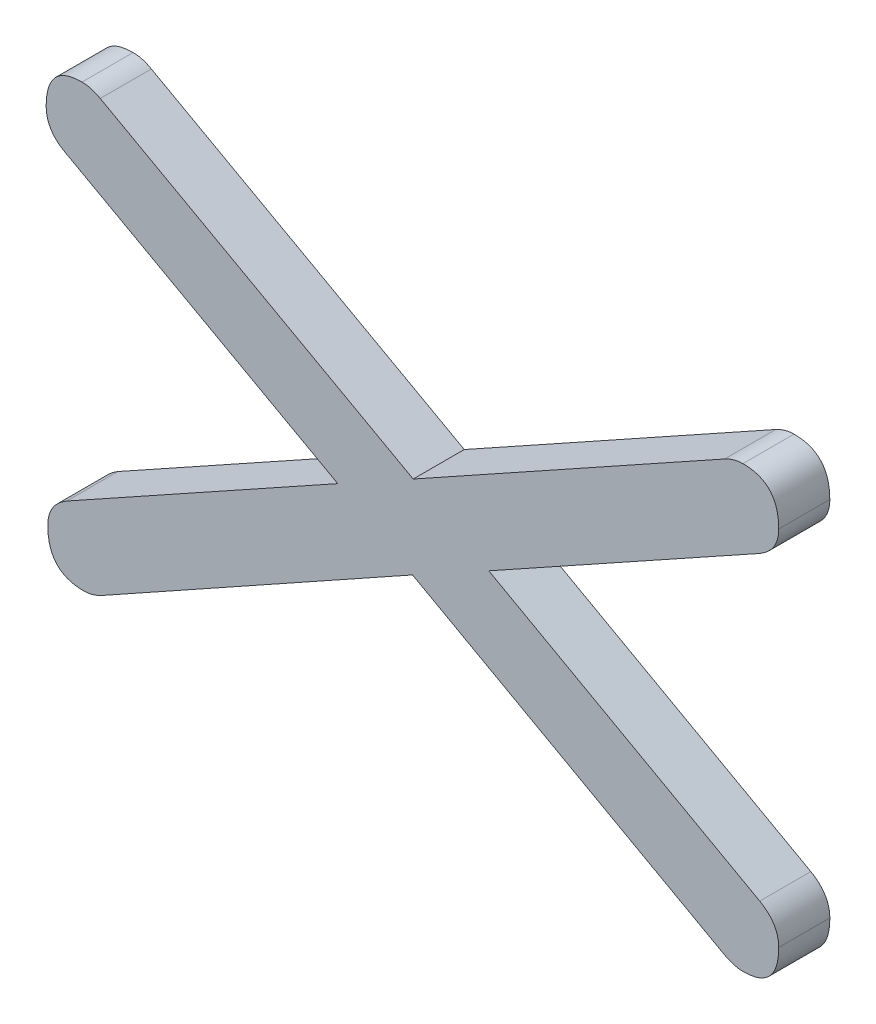
ISO-10303-21;
HEADER;
FILE_DESCRIPTION(('STEP AP214'),'2;1');
FILE_NAME('part.step','',(''),(''),'','','');
FILE_SCHEMA(('AUTOMOTIVE_DESIGN { 1 0 10303 214 1 1 1 1 }'));
ENDSEC;
DATA;
#1=APPLICATION_CONTEXT('core data for automotive mechanical design processes');
#2=APPLICATION_PROTOCOL_DEFINITION('international standard','automotive_design',2000,#1);
#3=PRODUCT_CONTEXT('',#1,'mechanical');
#4=PRODUCT('Part','Part','',(#3));
#5=PRODUCT_RELATED_PRODUCT_CATEGORY('part','',(#4));
#6=PRODUCT_DEFINITION_FORMATION('','',#4);
#7=PRODUCT_DEFINITION_CONTEXT('part definition',#1,'design');
#8=PRODUCT_DEFINITION('design','',#6,#7);
#9=PRODUCT_DEFINITION_SHAPE('','',#8);
#10=(LENGTH_UNIT() NAMED_UNIT(*) SI_UNIT(.MILLI.,.METRE.));
#11=(NAMED_UNIT(*) PLANE_ANGLE_UNIT() SI_UNIT($,.RADIAN.));
#12=(NAMED_UNIT(*) SI_UNIT($,.STERADIAN.) SOLID_ANGLE_UNIT());
#13=UNCERTAINTY_MEASURE_WITH_UNIT(LENGTH_MEASURE(1.E-05),#10,'distance_accuracy_value','');
#14=(GEOMETRIC_REPRESENTATION_CONTEXT(3) GLOBAL_UNCERTAINTY_ASSIGNED_CONTEXT((#13)) GLOBAL_UNIT_ASSIGNED_CONTEXT((#10,
#11,#12)) REPRESENTATION_CONTEXT('',''));
#15=CARTESIAN_POINT('',(0.,0.,0.));
#16=DIRECTION('',(0.,0.,1.));
#17=DIRECTION('',(1.,0.,0.));
#18=AXIS2_PLACEMENT_3D('',#15,#16,#17);
#19=CARTESIAN_POINT('',(0.8,12.2,-2.6));
#20=DIRECTION('',(0.,0.,1.));
#21=DIRECTION('',(1.,0.,0.));
#22=AXIS2_PLACEMENT_3D('',#19,#20,#21);
#23=PLANE('',#22);
#24=CARTESIAN_POINT('',(-1.8004,11.3994,-2.6));
#25=CARTESIAN_POINT('',(-1.8004,11.32365,-2.6));
#26=CARTESIAN_POINT('',(-1.7303,11.32365,-2.6));
#27=B_SPLINE_CURVE_WITH_KNOTS('',2,(#24,#25,#26),.UNSPECIFIED.,.F.,.F.,(3,3),(0.,1.),.UNSPECIFIED.);
#28=CARTESIAN_POINT('',(-1.8004,11.3994,-2.6));
#29=VERTEX_POINT('',#28);
#30=CARTESIAN_POINT('',(-1.7303,11.32365,-2.6));
#31=VERTEX_POINT('',#30);
#32=EDGE_CURVE('E202',#29,#31,#27,.T.);
#33=ORIENTED_EDGE('',*,*,#32,.T.);
#34=CARTESIAN_POINT('',(-1.7303,11.32365,-2.6));
#35=CARTESIAN_POINT('',(-1.72674873610482,11.323645480911,-2.6));
#36=CARTESIAN_POINT('',(-1.72322154157408,11.3239708863246,-2.6));
#37=CARTESIAN_POINT('',(-1.71626401609487,11.325176056098,-2.6));
#38=CARTESIAN_POINT('',(-1.71283359588712,11.3260552909242,-2.6));
#39=CARTESIAN_POINT('',(-1.70430723901425,11.3288555474114,-2.6));
#40=CARTESIAN_POINT('',(-1.69930568983797,11.3310824424114,-2.6));
#41=CARTESIAN_POINT('',(-1.69455,11.33365,-2.6));
#42=B_SPLINE_CURVE_WITH_KNOTS('',3,(#34,#35,#36,#37,#38,#39,#40,#41),.UNSPECIFIED.,.F.,.F.,(4,2,
2,4),(0.,0.0105992136815406,0.0211883084724336,0.0374613490171502),.UNSPECIFIED.);
#43=CARTESIAN_POINT('',(-1.69455,11.33365,-2.6));
#44=VERTEX_POINT('',#43);
#45=EDGE_CURVE('E178',#31,#44,#42,.T.);
#46=ORIENTED_EDGE('',*,*,#45,.T.);
#47=DIRECTION('',(0.873529571012869,0.486771084356982,0.));
#48=VECTOR('',#47,1.);
#49=CARTESIAN_POINT('',(-1.69455,11.33365,-2.6));
#50=LINE('',#49,#48);
#51=CARTESIAN_POINT('',(-1.08665,11.6724,-2.6));
#52=VERTEX_POINT('',#51);
#53=EDGE_CURVE('E176',#52,#44,#50,.F.);
#54=ORIENTED_EDGE('',*,*,#53,.F.);
#55=DIRECTION('',(0.874511603354022,-0.485004593379462,0.));
#56=VECTOR('',#55,1.);
#57=CARTESIAN_POINT('',(-1.08665,11.6724,-2.6));
#58=LINE('',#57,#56);
#59=CARTESIAN_POINT('',(-0.47585,11.33365,-2.6));
#60=VERTEX_POINT('',#59);
#61=EDGE_CURVE('E146',#60,#52,#58,.F.);
#62=ORIENTED_EDGE('',*,*,#61,.F.);
#63=CARTESIAN_POINT('',(-0.47585,11.33365,-2.6));
#64=CARTESIAN_POINT('',(-0.472752801885299,11.3319836587269,-2.6));
#65=CARTESIAN_POINT('',(-0.469561027604608,11.3304601961346,-2.6));
#66=CARTESIAN_POINT('',(-0.463018364400051,11.3278029139356,-2.6));
#67=CARTESIAN_POINT('',(-0.45966736496484,11.3266693695866,-2.6));
#68=CARTESIAN_POINT('',(-0.450997424090528,11.3244202712736,-2.6));
#69=CARTESIAN_POINT('',(-0.445593009487037,11.3236450218596,-2.6));
#70=CARTESIAN_POINT('',(-0.440100000014694,11.32365,-2.6));
#71=B_SPLINE_CURVE_WITH_KNOTS('',3,(#63,#64,#65,#66,#67,#68,#69,#70),.UNSPECIFIED.,.F.,.F.,(4,2,
2,4),(0.,0.0105730556527225,0.0211535599700237,0.0374479472269656),.UNSPECIFIED.);
#72=CARTESIAN_POINT('',(-0.4401,11.32365,-2.6));
#73=VERTEX_POINT('',#72);
#74=EDGE_CURVE('E24',#60,#73,#71,.T.);
#75=ORIENTED_EDGE('',*,*,#74,.T.);
#76=CARTESIAN_POINT('',(-0.4401,11.32365,-2.6));
#77=CARTESIAN_POINT('',(-0.37,11.32365,-2.6));
#78=CARTESIAN_POINT('',(-0.37,11.3994,-2.6));
#79=B_SPLINE_CURVE_WITH_KNOTS('',2,(#76,#77,#78),.UNSPECIFIED.,.F.,.F.,(3,3),(0.,1.),.UNSPECIFIED.);
#80=CARTESIAN_POINT('',(-0.37,11.3994,-2.6));
#81=VERTEX_POINT('',#80);
#82=EDGE_CURVE('E150',#73,#81,#79,.T.);
#83=ORIENTED_EDGE('',*,*,#82,.T.);
#84=CARTESIAN_POINT('',(-0.37,11.3994,-2.6));
#85=CARTESIAN_POINT('',(-0.37,11.438,-2.6));
#86=CARTESIAN_POINT('',(-0.40715,11.4594,-2.6));
#87=B_SPLINE_CURVE_WITH_KNOTS('',2,(#84,#85,#86),.UNSPECIFIED.,.F.,.F.,(3,3),(0.,1.),.UNSPECIFIED.);
#88=CARTESIAN_POINT('',(-0.40715,11.4594,-2.6));
#89=VERTEX_POINT('',#88);
#90=EDGE_CURVE('E182',#81,#89,#87,.T.);
#91=ORIENTED_EDGE('',*,*,#90,.T.);
#92=DIRECTION('',(-0.874165051646027,0.48562893497062,0.));
#93=VECTOR('',#92,1.);
#94=CARTESIAN_POINT('',(-0.40715,11.4594,-2.6));
#95=LINE('',#94,#93);
#96=CARTESIAN_POINT('',(-0.93745,11.754,-2.6));
#97=VERTEX_POINT('',#96);
#98=EDGE_CURVE('E336',#97,#89,#95,.F.);
#99=ORIENTED_EDGE('',*,*,#98,.F.);
#100=DIRECTION('',(0.87420004044454,0.485565947412671,0.));
#101=VECTOR('',#100,1.);
#102=CARTESIAN_POINT('',(-0.93745,11.754,-2.6));
#103=LINE('',#102,#101);
#104=CARTESIAN_POINT('',(-0.407150000000001,12.04855,-2.6));
#105=VERTEX_POINT('',#104);
#106=EDGE_CURVE('E341',#105,#97,#103,.F.);
#107=ORIENTED_EDGE('',*,*,#106,.F.);
#108=CARTESIAN_POINT('',(-0.40715,12.04855,-2.6));
#109=CARTESIAN_POINT('',(-0.37,12.07,-2.6));
#110=CARTESIAN_POINT('',(-0.37,12.1086,-2.6));
#111=B_SPLINE_CURVE_WITH_KNOTS('',2,(#108,#109,#110),.UNSPECIFIED.,.F.,.F.,(3,3),(0.,1.),.UNSPECIFIED.);
#112=CARTESIAN_POINT('',(-0.37,12.1086,-2.6));
#113=VERTEX_POINT('',#112);
#114=EDGE_CURVE('E210',#105,#113,#111,.T.);
#115=ORIENTED_EDGE('',*,*,#114,.T.);
#116=CARTESIAN_POINT('',(-0.37,12.1086,-2.6));
#117=CARTESIAN_POINT('',(-0.37,12.18435,-2.6));
#118=CARTESIAN_POINT('',(-0.4401,12.18435,-2.6));
#119=B_SPLINE_CURVE_WITH_KNOTS('',2,(#116,#117,#118),.UNSPECIFIED.,.F.,.F.,(3,3),(0.,1.),.UNSPECIFIED.);
#120=CARTESIAN_POINT('',(-0.4401,12.18435,-2.6));
#121=VERTEX_POINT('',#120);
#122=EDGE_CURVE('E214',#113,#121,#119,.T.);
#123=ORIENTED_EDGE('',*,*,#122,.T.);
#124=CARTESIAN_POINT('',(-0.4401,12.18435,-2.6));
#125=CARTESIAN_POINT('',(-0.443643347746503,12.1843549953723,-2.6));
#126=CARTESIAN_POINT('',(-0.447163301614119,12.1840325046237,-2.6));
#127=CARTESIAN_POINT('',(-0.454107279371382,12.1828353933846,-2.6));
#128=CARTESIAN_POINT('',(-0.45753138758187,12.1819612752255,-2.6));
#129=CARTESIAN_POINT('',(-0.466067450876708,12.1791651523464,-2.6));
#130=CARTESIAN_POINT('',(-0.471083515409301,12.176931744279,-2.6));
#131=CARTESIAN_POINT('',(-0.47585,12.17435,-2.6));
#132=B_SPLINE_CURVE_WITH_KNOTS('',3,(#124,#125,#126,#127,#128,#129,#130,#131),.UNSPECIFIED.,.F.,
.F.,(4,2,2,4),(0.,0.0105766380914163,0.0211436585971436,0.0374630894370165),.UNSPECIFIED.);
#133=CARTESIAN_POINT('',(-0.47585,12.17435,-2.6));
#134=VERTEX_POINT('',#133);
#135=EDGE_CURVE('E239',#121,#134,#132,.T.);
#136=ORIENTED_EDGE('',*,*,#135,.T.);
#137=DIRECTION('',(-0.874072706176062,-0.485795125868977,0.));
#138=VECTOR('',#137,1.);
#139=CARTESIAN_POINT('',(-0.47585,12.17435,-2.6));
#140=LINE('',#139,#138);
#141=CARTESIAN_POINT('',(-1.08535,11.8356,-2.6));
#142=VERTEX_POINT('',#141);
#143=EDGE_CURVE('E245',#142,#134,#140,.F.);
#144=ORIENTED_EDGE('',*,*,#143,.F.);
#145=DIRECTION('',(-0.875048850897596,0.484034615025409,0.));
#146=VECTOR('',#145,1.);
#147=CARTESIAN_POINT('',(-1.08535,11.8356,-2.6));
#148=LINE('',#147,#146);
#149=CARTESIAN_POINT('',(-1.69775,12.17435,-2.6));
#150=VERTEX_POINT('',#149);
#151=EDGE_CURVE('E351',#150,#142,#148,.F.);
#152=ORIENTED_EDGE('',*,*,#151,.F.);
#153=CARTESIAN_POINT('',(-1.69775,12.17435,-2.6));
#154=CARTESIAN_POINT('',(-1.70060913970605,12.1760275626728,-2.6));
#155=CARTESIAN_POINT('',(-1.70357896416293,12.1775251424389,-2.6));
#156=CARTESIAN_POINT('',(-1.70969234530551,12.1801124801558,-2.6));
#157=CARTESIAN_POINT('',(-1.71283598553168,12.1812020400113,-2.6));
#158=CARTESIAN_POINT('',(-1.72171331325313,12.1835862944224,-2.6));
#159=CARTESIAN_POINT('',(-1.72757833286025,12.1843935054454,-2.6));
#160=CARTESIAN_POINT('',(-1.7335,12.18435,-2.6));
#161=B_SPLINE_CURVE_WITH_KNOTS('',3,(#153,#154,#155,#156,#157,#158,#159,#160),.UNSPECIFIED.,.F.,
.F.,(4,2,2,4),(0.,0.00994530875591011,0.0198954397588307,0.0375033683794799),.UNSPECIFIED.);
#162=CARTESIAN_POINT('',(-1.7335,12.18435,-2.6));
#163=VERTEX_POINT('',#162);
#164=EDGE_CURVE('E234',#150,#163,#161,.T.);
#165=ORIENTED_EDGE('',*,*,#164,.T.);
#166=CARTESIAN_POINT('',(-1.7335,12.18435,-2.6));
#167=CARTESIAN_POINT('',(-1.8036,12.18435,-2.6));
#168=CARTESIAN_POINT('',(-1.8036,12.1086,-2.6));
#169=B_SPLINE_CURVE_WITH_KNOTS('',2,(#166,#167,#168),.UNSPECIFIED.,.F.,.F.,(3,3),(0.,1.),.UNSPECIFIED.);
#170=CARTESIAN_POINT('',(-1.8036,12.1086,-2.6));
#171=VERTEX_POINT('',#170);
#172=EDGE_CURVE('E218',#163,#171,#169,.T.);
#173=ORIENTED_EDGE('',*,*,#172,.T.);
#174=CARTESIAN_POINT('',(-1.8036,12.1086,-2.6));
#175=CARTESIAN_POINT('',(-1.8036,12.06855,-2.6));
#176=CARTESIAN_POINT('',(-1.7661,12.04855,-2.6));
#177=B_SPLINE_CURVE_WITH_KNOTS('',2,(#174,#175,#176),.UNSPECIFIED.,.F.,.F.,(3,3),(0.,1.),.UNSPECIFIED.);
#178=CARTESIAN_POINT('',(-1.7661,12.04855,-2.6));
#179=VERTEX_POINT('',#178);
#180=EDGE_CURVE('E222',#171,#179,#177,.T.);
#181=ORIENTED_EDGE('',*,*,#180,.T.);
#182=DIRECTION('',(0.87530097163522,-0.483578544865712,0.));
#183=VECTOR('',#182,1.);
#184=CARTESIAN_POINT('',(-1.7661,12.04855,-2.6));
#185=LINE('',#184,#183);
#186=CARTESIAN_POINT('',(-1.23295,11.754,-2.6));
#187=VERTEX_POINT('',#186);
#188=EDGE_CURVE('E357',#187,#179,#185,.F.);
#189=ORIENTED_EDGE('',*,*,#188,.F.);
#190=DIRECTION('',(-0.874145611574188,-0.485663926769931,0.));
#191=VECTOR('',#190,1.);
#192=CARTESIAN_POINT('',(-1.23295,11.754,-2.6));
#193=LINE('',#192,#191);
#194=CARTESIAN_POINT('',(-1.7632,11.4594,-2.6));
#195=VERTEX_POINT('',#194);
#196=EDGE_CURVE('E361',#195,#187,#193,.F.);
#197=ORIENTED_EDGE('',*,*,#196,.F.);
#198=CARTESIAN_POINT('',(-1.7632,11.4594,-2.6));
#199=CARTESIAN_POINT('',(-1.8004,11.438,-2.6));
#200=CARTESIAN_POINT('',(-1.8004,11.3994,-2.6));
#201=B_SPLINE_CURVE_WITH_KNOTS('',2,(#198,#199,#200),.UNSPECIFIED.,.F.,.F.,(3,3),(0.,1.),.UNSPECIFIED.);
#202=EDGE_CURVE('E225',#195,#29,#201,.T.);
#203=ORIENTED_EDGE('',*,*,#202,.T.);
#204=EDGE_LOOP('',(#33,#46,#54,#62,#75,#83,#91,#99,#107,#115,#123,#136,#144,#152,#165,#173,#181,
#189,#197,#203));
#205=FACE_BOUND('',#204,.T.);
#206=ADVANCED_FACE('F17',(#205),#23,.T.);
#207=CARTESIAN_POINT('',(-1.08665,11.6724,-2.7));
#208=DIRECTION('',(-0.485004593379462,-0.874511603354022,0.));
#209=DIRECTION('',(0.874511603354022,-0.485004593379462,0.));
#210=AXIS2_PLACEMENT_3D('',#207,#208,#209);
#211=PLANE('',#210);
#212=DIRECTION('',(0.874511603354023,-0.48500459337946,0.));
#213=VECTOR('',#212,1.);
#214=CARTESIAN_POINT('',(-1.08665,11.6724,-2.7));
#215=LINE('',#214,#213);
#216=CARTESIAN_POINT('',(-1.08665,11.6724,-2.7));
#217=VERTEX_POINT('',#216);
#218=CARTESIAN_POINT('',(-0.47585,11.33365,-2.7));
#219=VERTEX_POINT('',#218);
#220=EDGE_CURVE('E421',#217,#219,#215,.T.);
#221=ORIENTED_EDGE('',*,*,#220,.T.);
#222=DIRECTION('',(0.,0.,1.));
#223=VECTOR('',#222,1.);
#224=CARTESIAN_POINT('',(-0.47585,11.33365,-2.65));
#225=LINE('',#224,#223);
#226=EDGE_CURVE('E156',#219,#60,#225,.T.);
#227=ORIENTED_EDGE('',*,*,#226,.T.);
#228=ORIENTED_EDGE('',*,*,#61,.T.);
#229=DIRECTION('',(0.,0.,1.));
#230=VECTOR('',#229,1.);
#231=CARTESIAN_POINT('',(-1.08665,11.6724,-2.7));
#232=LINE('',#231,#230);
#233=EDGE_CURVE('E423',#217,#52,#232,.T.);
#234=ORIENTED_EDGE('',*,*,#233,.F.);
#235=EDGE_LOOP('',(#221,#227,#228,#234));
#236=FACE_BOUND('',#235,.T.);
#237=ADVANCED_FACE('F193',(#236),#211,.T.);
#238=CARTESIAN_POINT('',(-0.47585,11.33365,-2.7));
#239=CARTESIAN_POINT('',(-0.45725,11.32365,-2.7));
#240=CARTESIAN_POINT('',(-0.4401,11.32365,-2.7));
#241=CARTESIAN_POINT('',(-0.47585,11.33365,-2.6));
#242=CARTESIAN_POINT('',(-0.45725,11.32365,-2.6));
#243=CARTESIAN_POINT('',(-0.4401,11.32365,-2.6));
#244=B_SPLINE_SURFACE_WITH_KNOTS('',1,2,((#238,#239,#240),(#241,#242,#243)),.UNSPECIFIED.,.F.,
.F.,.F.,(2,2),(3,3),(0.,1.),(0.,1.),.UNSPECIFIED.);
#245=CARTESIAN_POINT('',(-0.47585,11.33365,-2.7));
#246=CARTESIAN_POINT('',(-0.472752801885299,11.3319836587269,-2.7));
#247=CARTESIAN_POINT('',(-0.469561027604608,11.3304601961346,-2.7));
#248=CARTESIAN_POINT('',(-0.463018364400052,11.3278029139356,-2.7));
#249=CARTESIAN_POINT('',(-0.45966736496484,11.3266693695866,-2.7));
#250=CARTESIAN_POINT('',(-0.450997424090529,11.3244202712736,-2.7));
#251=CARTESIAN_POINT('',(-0.445593009487037,11.3236450218596,-2.7));
#252=CARTESIAN_POINT('',(-0.440100000014694,11.32365,-2.7));
#253=B_SPLINE_CURVE_WITH_KNOTS('',3,(#245,#246,#247,#248,#249,#250,#251,#252),.UNSPECIFIED.,.F.,
.F.,(4,2,2,4),(0.,0.010573055652721,0.0211535599700234,0.0374479472269654),.UNSPECIFIED.);
#254=CARTESIAN_POINT('',(-0.4401,11.32365,-2.7));
#255=VERTEX_POINT('',#254);
#256=EDGE_CURVE('E167',#219,#255,#253,.T.);
#257=DIRECTION('',(0.,0.,1.));
#258=VECTOR('',#257,1.);
#259=CARTESIAN_POINT('',(-0.4401,11.32365,-2.65));
#260=LINE('',#259,#258);
#261=EDGE_CURVE('E155',#255,#73,#260,.T.);
#262=ORIENTED_EDGE('',*,*,#226,.F.);
#263=ORIENTED_EDGE('',*,*,#256,.T.);
#264=ORIENTED_EDGE('',*,*,#261,.T.);
#265=ORIENTED_EDGE('',*,*,#74,.F.);
#266=EDGE_LOOP('',(#262,#263,#264,#265));
#267=FACE_BOUND('',#266,.T.);
#268=ADVANCED_FACE('F165',(#267),#244,.F.);
#269=CARTESIAN_POINT('',(-0.4401,11.32365,-2.7));
#270=CARTESIAN_POINT('',(-0.37,11.32365,-2.7));
#271=CARTESIAN_POINT('',(-0.37,11.3994,-2.7));
#272=CARTESIAN_POINT('',(-0.4401,11.32365,-2.6));
#273=CARTESIAN_POINT('',(-0.37,11.32365,-2.6));
#274=CARTESIAN_POINT('',(-0.37,11.3994,-2.6));
#275=B_SPLINE_SURFACE_WITH_KNOTS('',1,2,((#269,#270,#271),(#272,#273,#274)),.UNSPECIFIED.,.F.,
.F.,.F.,(2,2),(3,3),(0.,1.),(0.,1.),.UNSPECIFIED.);
#276=CARTESIAN_POINT('',(-0.4401,11.32365,-2.7));
#277=CARTESIAN_POINT('',(-0.37,11.32365,-2.7));
#278=CARTESIAN_POINT('',(-0.37,11.3994,-2.7));
#279=B_SPLINE_CURVE_WITH_KNOTS('',2,(#276,#277,#278),.UNSPECIFIED.,.F.,.F.,(3,3),(0.,1.),.UNSPECIFIED.);
#280=CARTESIAN_POINT('',(-0.37,11.3994,-2.7));
#281=VERTEX_POINT('',#280);
#282=EDGE_CURVE('E304',#255,#281,#279,.T.);
#283=DIRECTION('',(0.,0.,1.));
#284=VECTOR('',#283,1.);
#285=CARTESIAN_POINT('',(-0.37,11.3994,-2.65));
#286=LINE('',#285,#284);
#287=EDGE_CURVE('E162',#281,#81,#286,.T.);
#288=ORIENTED_EDGE('',*,*,#261,.F.);
#289=ORIENTED_EDGE('',*,*,#282,.T.);
#290=ORIENTED_EDGE('',*,*,#287,.T.);
#291=ORIENTED_EDGE('',*,*,#82,.F.);
#292=EDGE_LOOP('',(#288,#289,#290,#291));
#293=FACE_BOUND('',#292,.T.);
#294=ADVANCED_FACE('F159',(#293),#275,.F.);
#295=CARTESIAN_POINT('',(-0.37,11.3994,-2.7));
#296=CARTESIAN_POINT('',(-0.37,11.438,-2.7));
#297=CARTESIAN_POINT('',(-0.40715,11.4594,-2.7));
#298=CARTESIAN_POINT('',(-0.37,11.3994,-2.6));
#299=CARTESIAN_POINT('',(-0.37,11.438,-2.6));
#300=CARTESIAN_POINT('',(-0.40715,11.4594,-2.6));
#301=B_SPLINE_SURFACE_WITH_KNOTS('',1,2,((#295,#296,#297),(#298,#299,#300)),.UNSPECIFIED.,.F.,
.F.,.F.,(2,2),(3,3),(0.,1.),(0.,1.),.UNSPECIFIED.);
#302=CARTESIAN_POINT('',(-0.37,11.3994,-2.7));
#303=CARTESIAN_POINT('',(-0.37,11.438,-2.7));
#304=CARTESIAN_POINT('',(-0.40715,11.4594,-2.7));
#305=B_SPLINE_CURVE_WITH_KNOTS('',2,(#302,#303,#304),.UNSPECIFIED.,.F.,.F.,(3,3),(0.,1.),.UNSPECIFIED.);
#306=CARTESIAN_POINT('',(-0.40715,11.4594,-2.7));
#307=VERTEX_POINT('',#306);
#308=EDGE_CURVE('E308',#281,#307,#305,.T.);
#309=DIRECTION('',(0.,0.,1.));
#310=VECTOR('',#309,1.);
#311=CARTESIAN_POINT('',(-0.40715,11.4594,-2.7));
#312=LINE('',#311,#310);
#313=EDGE_CURVE('E338',#89,#307,#312,.F.);
#314=ORIENTED_EDGE('',*,*,#287,.F.);
#315=ORIENTED_EDGE('',*,*,#308,.T.);
#316=ORIENTED_EDGE('',*,*,#313,.F.);
#317=ORIENTED_EDGE('',*,*,#90,.F.);
#318=EDGE_LOOP('',(#314,#315,#316,#317));
#319=FACE_BOUND('',#318,.T.);
#320=ADVANCED_FACE('F420',(#319),#301,.F.);
#321=CARTESIAN_POINT('',(-0.40715,11.4594,-2.7));
#322=DIRECTION('',(0.48562893497062,0.874165051646027,0.));
#323=DIRECTION('',(-0.874165051646027,0.48562893497062,0.));
#324=AXIS2_PLACEMENT_3D('',#321,#322,#323);
#325=PLANE('',#324);
#326=DIRECTION('',(-0.874165051646027,0.485628934970621,0.));
#327=VECTOR('',#326,1.);
#328=CARTESIAN_POINT('',(-0.40715,11.4594,-2.7));
#329=LINE('',#328,#327);
#330=CARTESIAN_POINT('',(-0.93745,11.754,-2.7));
#331=VERTEX_POINT('',#330);
#332=EDGE_CURVE('E409',#307,#331,#329,.T.);
#333=ORIENTED_EDGE('',*,*,#332,.T.);
#334=DIRECTION('',(0.,0.,1.));
#335=VECTOR('',#334,1.);
#336=CARTESIAN_POINT('',(-0.93745,11.754,-2.7));
#337=LINE('',#336,#335);
#338=EDGE_CURVE('E344',#97,#331,#337,.F.);
#339=ORIENTED_EDGE('',*,*,#338,.F.);
#340=ORIENTED_EDGE('',*,*,#98,.T.);
#341=ORIENTED_EDGE('',*,*,#313,.T.);
#342=EDGE_LOOP('',(#333,#339,#340,#341));
#343=FACE_BOUND('',#342,.T.);
#344=ADVANCED_FACE('F407',(#343),#325,.T.);
#345=CARTESIAN_POINT('',(-0.93745,11.754,-2.7));
#346=DIRECTION('',(0.485565947412671,-0.87420004044454,0.));
#347=DIRECTION('',(0.87420004044454,0.485565947412671,0.));
#348=AXIS2_PLACEMENT_3D('',#345,#346,#347);
#349=PLANE('',#348);
#350=DIRECTION('',(0.874200040444541,0.48556594741267,0.));
#351=VECTOR('',#350,1.);
#352=CARTESIAN_POINT('',(-0.93745,11.754,-2.7));
#353=LINE('',#352,#351);
#354=CARTESIAN_POINT('',(-0.40715,12.04855,-2.7));
#355=VERTEX_POINT('',#354);
#356=EDGE_CURVE('E418',#331,#355,#353,.T.);
#357=ORIENTED_EDGE('',*,*,#356,.T.);
#358=DIRECTION('',(0.,0.,1.));
#359=VECTOR('',#358,1.);
#360=CARTESIAN_POINT('',(-0.40715,12.04855,-2.65));
#361=LINE('',#360,#359);
#362=EDGE_CURVE('E397',#355,#105,#361,.T.);
#363=ORIENTED_EDGE('',*,*,#362,.T.);
#364=ORIENTED_EDGE('',*,*,#106,.T.);
#365=ORIENTED_EDGE('',*,*,#338,.T.);
#366=EDGE_LOOP('',(#357,#363,#364,#365));
#367=FACE_BOUND('',#366,.T.);
#368=ADVANCED_FACE('F496',(#367),#349,.T.);
#369=CARTESIAN_POINT('',(-0.40715,12.04855,-2.7));
#370=CARTESIAN_POINT('',(-0.37,12.07,-2.7));
#371=CARTESIAN_POINT('',(-0.37,12.1086,-2.7));
#372=CARTESIAN_POINT('',(-0.40715,12.04855,-2.6));
#373=CARTESIAN_POINT('',(-0.37,12.07,-2.6));
#374=CARTESIAN_POINT('',(-0.37,12.1086,-2.6));
#375=B_SPLINE_SURFACE_WITH_KNOTS('',1,2,((#369,#370,#371),(#372,#373,#374)),.UNSPECIFIED.,.F.,
.F.,.F.,(2,2),(3,3),(0.,1.),(0.,1.),.UNSPECIFIED.);
#376=CARTESIAN_POINT('',(-0.40715,12.04855,-2.7));
#377=CARTESIAN_POINT('',(-0.37,12.07,-2.7));
#378=CARTESIAN_POINT('',(-0.37,12.1086,-2.7));
#379=B_SPLINE_CURVE_WITH_KNOTS('',2,(#376,#377,#378),.UNSPECIFIED.,.F.,.F.,(3,3),(0.,1.),.UNSPECIFIED.);
#380=CARTESIAN_POINT('',(-0.37,12.1086,-2.7));
#381=VERTEX_POINT('',#380);
#382=EDGE_CURVE('E312',#355,#381,#379,.T.);
#383=DIRECTION('',(0.,0.,1.));
#384=VECTOR('',#383,1.);
#385=CARTESIAN_POINT('',(-0.37,12.1086,-2.65));
#386=LINE('',#385,#384);
#387=EDGE_CURVE('E394',#381,#113,#386,.T.);
#388=ORIENTED_EDGE('',*,*,#362,.F.);
#389=ORIENTED_EDGE('',*,*,#382,.T.);
#390=ORIENTED_EDGE('',*,*,#387,.T.);
#391=ORIENTED_EDGE('',*,*,#114,.F.);
#392=EDGE_LOOP('',(#388,#389,#390,#391));
#393=FACE_BOUND('',#392,.T.);
#394=ADVANCED_FACE('F495',(#393),#375,.F.);
#395=CARTESIAN_POINT('',(-0.37,12.1086,-2.7));
#396=CARTESIAN_POINT('',(-0.37,12.18435,-2.7));
#397=CARTESIAN_POINT('',(-0.4401,12.18435,-2.7));
#398=CARTESIAN_POINT('',(-0.37,12.1086,-2.6));
#399=CARTESIAN_POINT('',(-0.37,12.18435,-2.6));
#400=CARTESIAN_POINT('',(-0.4401,12.18435,-2.6));
#401=B_SPLINE_SURFACE_WITH_KNOTS('',1,2,((#395,#396,#397),(#398,#399,#400)),.UNSPECIFIED.,.F.,
.F.,.F.,(2,2),(3,3),(0.,1.),(0.,1.),.UNSPECIFIED.);
#402=CARTESIAN_POINT('',(-0.37,12.1086,-2.7));
#403=CARTESIAN_POINT('',(-0.37,12.18435,-2.7));
#404=CARTESIAN_POINT('',(-0.4401,12.18435,-2.7));
#405=B_SPLINE_CURVE_WITH_KNOTS('',2,(#402,#403,#404),.UNSPECIFIED.,.F.,.F.,(3,3),(0.,1.),.UNSPECIFIED.);
#406=CARTESIAN_POINT('',(-0.4401,12.18435,-2.7));
#407=VERTEX_POINT('',#406);
#408=EDGE_CURVE('E279',#381,#407,#405,.T.);
#409=DIRECTION('',(0.,0.,1.));
#410=VECTOR('',#409,1.);
#411=CARTESIAN_POINT('',(-0.4401,12.18435,-2.65));
#412=LINE('',#411,#410);
#413=EDGE_CURVE('E246',#407,#121,#412,.T.);
#414=ORIENTED_EDGE('',*,*,#387,.F.);
#415=ORIENTED_EDGE('',*,*,#408,.T.);
#416=ORIENTED_EDGE('',*,*,#413,.T.);
#417=ORIENTED_EDGE('',*,*,#122,.F.);
#418=EDGE_LOOP('',(#414,#415,#416,#417));
#419=FACE_BOUND('',#418,.T.);
#420=ADVANCED_FACE('F254',(#419),#401,.F.);
#421=CARTESIAN_POINT('',(-0.4401,12.18435,-2.7));
#422=CARTESIAN_POINT('',(-0.4573,12.18435,-2.7));
#423=CARTESIAN_POINT('',(-0.47585,12.17435,-2.7));
#424=CARTESIAN_POINT('',(-0.4401,12.18435,-2.6));
#425=CARTESIAN_POINT('',(-0.4573,12.18435,-2.6));
#426=CARTESIAN_POINT('',(-0.47585,12.17435,-2.6));
#427=B_SPLINE_SURFACE_WITH_KNOTS('',1,2,((#421,#422,#423),(#424,#425,#426)),.UNSPECIFIED.,.F.,
.F.,.F.,(2,2),(3,3),(0.,1.),(0.,1.),.UNSPECIFIED.);
#428=CARTESIAN_POINT('',(-0.4401,12.18435,-2.7));
#429=CARTESIAN_POINT('',(-0.443643347746503,12.1843549953723,-2.7));
#430=CARTESIAN_POINT('',(-0.447163301614119,12.1840325046237,-2.7));
#431=CARTESIAN_POINT('',(-0.454107279371382,12.1828353933846,-2.7));
#432=CARTESIAN_POINT('',(-0.45753138758187,12.1819612752255,-2.7));
#433=CARTESIAN_POINT('',(-0.466067450876708,12.1791651523464,-2.7));
#434=CARTESIAN_POINT('',(-0.471083515409301,12.176931744279,-2.7));
#435=CARTESIAN_POINT('',(-0.47585,12.17435,-2.7));
#436=B_SPLINE_CURVE_WITH_KNOTS('',3,(#428,#429,#430,#431,#432,#433,#434,#435),.UNSPECIFIED.,.F.,
.F.,(4,2,2,4),(0.,0.0105766380914163,0.0211436585971436,0.0374630894370165),.UNSPECIFIED.);
#437=CARTESIAN_POINT('',(-0.47585,12.17435,-2.7));
#438=VERTEX_POINT('',#437);
#439=EDGE_CURVE('E271',#407,#438,#436,.T.);
#440=DIRECTION('',(0.,0.,1.));
#441=VECTOR('',#440,1.);
#442=CARTESIAN_POINT('',(-0.47585,12.17435,-2.7));
#443=LINE('',#442,#441);
#444=EDGE_CURVE('E348',#134,#438,#443,.F.);
#445=ORIENTED_EDGE('',*,*,#413,.F.);
#446=ORIENTED_EDGE('',*,*,#439,.T.);
#447=ORIENTED_EDGE('',*,*,#444,.F.);
#448=ORIENTED_EDGE('',*,*,#135,.F.);
#449=EDGE_LOOP('',(#445,#446,#447,#448));
#450=FACE_BOUND('',#449,.T.);
#451=ADVANCED_FACE('F247',(#450),#427,.F.);
#452=CARTESIAN_POINT('',(-0.47585,12.17435,-2.7));
#453=DIRECTION('',(-0.485795125868977,0.874072706176062,0.));
#454=DIRECTION('',(-0.874072706176062,-0.485795125868977,0.));
#455=AXIS2_PLACEMENT_3D('',#452,#453,#454);
#456=PLANE('',#455);
#457=DIRECTION('',(-0.874072706176062,-0.485795125868977,0.));
#458=VECTOR('',#457,1.);
#459=CARTESIAN_POINT('',(-0.47585,12.17435,-2.7));
#460=LINE('',#459,#458);
#461=CARTESIAN_POINT('',(-1.08535,11.8356,-2.7));
#462=VERTEX_POINT('',#461);
#463=EDGE_CURVE('E278',#438,#462,#460,.T.);
#464=ORIENTED_EDGE('',*,*,#463,.T.);
#465=DIRECTION('',(0.,0.,1.));
#466=VECTOR('',#465,1.);
#467=CARTESIAN_POINT('',(-1.08535,11.8356,-2.7));
#468=LINE('',#467,#466);
#469=EDGE_CURVE('E354',#142,#462,#468,.F.);
#470=ORIENTED_EDGE('',*,*,#469,.F.);
#471=ORIENTED_EDGE('',*,*,#143,.T.);
#472=ORIENTED_EDGE('',*,*,#444,.T.);
#473=EDGE_LOOP('',(#464,#470,#471,#472));
#474=FACE_BOUND('',#473,.T.);
#475=ADVANCED_FACE('F253',(#474),#456,.T.);
#476=CARTESIAN_POINT('',(-1.08535,11.8356,-2.7));
#477=DIRECTION('',(0.484034615025409,0.875048850897596,0.));
#478=DIRECTION('',(-0.875048850897596,0.484034615025409,0.));
#479=AXIS2_PLACEMENT_3D('',#476,#477,#478);
#480=PLANE('',#479);
#481=DIRECTION('',(-0.875048850897596,0.48403461502541,0.));
#482=VECTOR('',#481,1.);
#483=CARTESIAN_POINT('',(-1.08535,11.8356,-2.7));
#484=LINE('',#483,#482);
#485=CARTESIAN_POINT('',(-1.69775,12.17435,-2.7));
#486=VERTEX_POINT('',#485);
#487=EDGE_CURVE('E469',#462,#486,#484,.T.);
#488=ORIENTED_EDGE('',*,*,#487,.T.);
#489=DIRECTION('',(0.,0.,1.));
#490=VECTOR('',#489,1.);
#491=CARTESIAN_POINT('',(-1.69775,12.17435,-2.65));
#492=LINE('',#491,#490);
#493=EDGE_CURVE('E384',#486,#150,#492,.T.);
#494=ORIENTED_EDGE('',*,*,#493,.T.);
#495=ORIENTED_EDGE('',*,*,#151,.T.);
#496=ORIENTED_EDGE('',*,*,#469,.T.);
#497=EDGE_LOOP('',(#488,#494,#495,#496));
#498=FACE_BOUND('',#497,.T.);
#499=ADVANCED_FACE('F556',(#498),#480,.T.);
#500=CARTESIAN_POINT('',(-1.69775,12.17435,-2.7));
#501=CARTESIAN_POINT('',(-1.7149,12.18435,-2.7));
#502=CARTESIAN_POINT('',(-1.7335,12.18435,-2.7));
#503=CARTESIAN_POINT('',(-1.69775,12.17435,-2.6));
#504=CARTESIAN_POINT('',(-1.7149,12.18435,-2.6));
#505=CARTESIAN_POINT('',(-1.7335,12.18435,-2.6));
#506=B_SPLINE_SURFACE_WITH_KNOTS('',1,2,((#500,#501,#502),(#503,#504,#505)),.UNSPECIFIED.,.F.,
.F.,.F.,(2,2),(3,3),(0.,1.),(0.,1.),.UNSPECIFIED.);
#507=CARTESIAN_POINT('',(-1.69775,12.17435,-2.7));
#508=CARTESIAN_POINT('',(-1.70060913970605,12.1760275626728,-2.7));
#509=CARTESIAN_POINT('',(-1.70357896416293,12.1775251424389,-2.7));
#510=CARTESIAN_POINT('',(-1.70969234530551,12.1801124801558,-2.7));
#511=CARTESIAN_POINT('',(-1.71283598553168,12.1812020400113,-2.7));
#512=CARTESIAN_POINT('',(-1.72171331325313,12.1835862944224,-2.7));
#513=CARTESIAN_POINT('',(-1.72757833286025,12.1843935054454,-2.7));
#514=CARTESIAN_POINT('',(-1.7335,12.18435,-2.7));
#515=B_SPLINE_CURVE_WITH_KNOTS('',3,(#507,#508,#509,#510,#511,#512,#513,#514),.UNSPECIFIED.,.F.,
.F.,(4,2,2,4),(0.,0.00994530875591011,0.0198954397588307,0.0375033683794799),.UNSPECIFIED.);
#516=CARTESIAN_POINT('',(-1.7335,12.18435,-2.7));
#517=VERTEX_POINT('',#516);
#518=EDGE_CURVE('E280',#486,#517,#515,.T.);
#519=DIRECTION('',(0.,0.,1.));
#520=VECTOR('',#519,1.);
#521=CARTESIAN_POINT('',(-1.7335,12.18435,-2.65));
#522=LINE('',#521,#520);
#523=EDGE_CURVE('E381',#517,#163,#522,.T.);
#524=ORIENTED_EDGE('',*,*,#493,.F.);
#525=ORIENTED_EDGE('',*,*,#518,.T.);
#526=ORIENTED_EDGE('',*,*,#523,.T.);
#527=ORIENTED_EDGE('',*,*,#164,.F.);
#528=EDGE_LOOP('',(#524,#525,#526,#527));
#529=FACE_BOUND('',#528,.T.);
#530=ADVANCED_FACE('F259',(#529),#506,.F.);
#531=CARTESIAN_POINT('',(-1.7335,12.18435,-2.7));
#532=CARTESIAN_POINT('',(-1.8036,12.18435,-2.7));
#533=CARTESIAN_POINT('',(-1.8036,12.1086,-2.7));
#534=CARTESIAN_POINT('',(-1.7335,12.18435,-2.6));
#535=CARTESIAN_POINT('',(-1.8036,12.18435,-2.6));
#536=CARTESIAN_POINT('',(-1.8036,12.1086,-2.6));
#537=B_SPLINE_SURFACE_WITH_KNOTS('',1,2,((#531,#532,#533),(#534,#535,#536)),.UNSPECIFIED.,.F.,
.F.,.F.,(2,2),(3,3),(0.,1.),(0.,1.),.UNSPECIFIED.);
#538=CARTESIAN_POINT('',(-1.7335,12.18435,-2.7));
#539=CARTESIAN_POINT('',(-1.8036,12.18435,-2.7));
#540=CARTESIAN_POINT('',(-1.8036,12.1086,-2.7));
#541=B_SPLINE_CURVE_WITH_KNOTS('',2,(#538,#539,#540),.UNSPECIFIED.,.F.,.F.,(3,3),(0.,1.),.UNSPECIFIED.);
#542=CARTESIAN_POINT('',(-1.8036,12.1086,-2.7));
#543=VERTEX_POINT('',#542);
#544=EDGE_CURVE('E319',#517,#543,#541,.T.);
#545=DIRECTION('',(0.,0.,1.));
#546=VECTOR('',#545,1.);
#547=CARTESIAN_POINT('',(-1.8036,12.1086,-2.65));
#548=LINE('',#547,#546);
#549=EDGE_CURVE('E378',#543,#171,#548,.T.);
#550=ORIENTED_EDGE('',*,*,#523,.F.);
#551=ORIENTED_EDGE('',*,*,#544,.T.);
#552=ORIENTED_EDGE('',*,*,#549,.T.);
#553=ORIENTED_EDGE('',*,*,#172,.F.);
#554=EDGE_LOOP('',(#550,#551,#552,#553));
#555=FACE_BOUND('',#554,.T.);
#556=ADVANCED_FACE('F537',(#555),#537,.F.);
#557=CARTESIAN_POINT('',(-1.8036,12.1086,-2.7));
#558=CARTESIAN_POINT('',(-1.8036,12.06855,-2.7));
#559=CARTESIAN_POINT('',(-1.7661,12.04855,-2.7));
#560=CARTESIAN_POINT('',(-1.8036,12.1086,-2.6));
#561=CARTESIAN_POINT('',(-1.8036,12.06855,-2.6));
#562=CARTESIAN_POINT('',(-1.7661,12.04855,-2.6));
#563=B_SPLINE_SURFACE_WITH_KNOTS('',1,2,((#557,#558,#559),(#560,#561,#562)),.UNSPECIFIED.,.F.,
.F.,.F.,(2,2),(3,3),(0.,1.),(0.,1.),.UNSPECIFIED.);
#564=CARTESIAN_POINT('',(-1.8036,12.1086,-2.7));
#565=CARTESIAN_POINT('',(-1.8036,12.06855,-2.7));
#566=CARTESIAN_POINT('',(-1.7661,12.04855,-2.7));
#567=B_SPLINE_CURVE_WITH_KNOTS('',2,(#564,#565,#566),.UNSPECIFIED.,.F.,.F.,(3,3),(0.,1.),.UNSPECIFIED.);
#568=CARTESIAN_POINT('',(-1.7661,12.04855,-2.7));
#569=VERTEX_POINT('',#568);
#570=EDGE_CURVE('E323',#543,#569,#567,.T.);
#571=DIRECTION('',(0.,0.,1.));
#572=VECTOR('',#571,1.);
#573=CARTESIAN_POINT('',(-1.7661,12.04855,-2.7));
#574=LINE('',#573,#572);
#575=EDGE_CURVE('E359',#179,#569,#574,.F.);
#576=ORIENTED_EDGE('',*,*,#549,.F.);
#577=ORIENTED_EDGE('',*,*,#570,.T.);
#578=ORIENTED_EDGE('',*,*,#575,.F.);
#579=ORIENTED_EDGE('',*,*,#180,.F.);
#580=EDGE_LOOP('',(#576,#577,#578,#579));
#581=FACE_BOUND('',#580,.T.);
#582=ADVANCED_FACE('F527',(#581),#563,.F.);
#583=CARTESIAN_POINT('',(-1.7661,12.04855,-2.7));
#584=DIRECTION('',(-0.483578544865712,-0.87530097163522,0.));
#585=DIRECTION('',(0.87530097163522,-0.483578544865712,0.));
#586=AXIS2_PLACEMENT_3D('',#583,#584,#585);
#587=PLANE('',#586);
#588=DIRECTION('',(0.875300971635221,-0.483578544865711,0.));
#589=VECTOR('',#588,1.);
#590=CARTESIAN_POINT('',(-1.7661,12.04855,-2.7));
#591=LINE('',#590,#589);
#592=CARTESIAN_POINT('',(-1.23295,11.754,-2.7));
#593=VERTEX_POINT('',#592);
#594=EDGE_CURVE('E459',#569,#593,#591,.T.);
#595=ORIENTED_EDGE('',*,*,#594,.T.);
#596=DIRECTION('',(0.,0.,1.));
#597=VECTOR('',#596,1.);
#598=CARTESIAN_POINT('',(-1.23295,11.754,-2.7));
#599=LINE('',#598,#597);
#600=EDGE_CURVE('E363',#187,#593,#599,.F.);
#601=ORIENTED_EDGE('',*,*,#600,.F.);
#602=ORIENTED_EDGE('',*,*,#188,.T.);
#603=ORIENTED_EDGE('',*,*,#575,.T.);
#604=EDGE_LOOP('',(#595,#601,#602,#603));
#605=FACE_BOUND('',#604,.T.);
#606=ADVANCED_FACE('F536',(#605),#587,.T.);
#607=CARTESIAN_POINT('',(-1.23295,11.754,-2.7));
#608=DIRECTION('',(-0.485663926769931,0.874145611574188,0.));
#609=DIRECTION('',(-0.874145611574188,-0.485663926769931,0.));
#610=AXIS2_PLACEMENT_3D('',#607,#608,#609);
#611=PLANE('',#610);
#612=DIRECTION('',(-0.874145611574188,-0.485663926769932,0.));
#613=VECTOR('',#612,1.);
#614=CARTESIAN_POINT('',(-1.23295,11.754,-2.7));
#615=LINE('',#614,#613);
#616=CARTESIAN_POINT('',(-1.7632,11.4594,-2.7));
#617=VERTEX_POINT('',#616);
#618=EDGE_CURVE('E458',#593,#617,#615,.T.);
#619=ORIENTED_EDGE('',*,*,#618,.T.);
#620=DIRECTION('',(0.,0.,1.));
#621=VECTOR('',#620,1.);
#622=CARTESIAN_POINT('',(-1.7632,11.4594,-2.65));
#623=LINE('',#622,#621);
#624=EDGE_CURVE('E368',#617,#195,#623,.T.);
#625=ORIENTED_EDGE('',*,*,#624,.T.);
#626=ORIENTED_EDGE('',*,*,#196,.T.);
#627=ORIENTED_EDGE('',*,*,#600,.T.);
#628=EDGE_LOOP('',(#619,#625,#626,#627));
#629=FACE_BOUND('',#628,.T.);
#630=ADVANCED_FACE('F515',(#629),#611,.T.);
#631=CARTESIAN_POINT('',(-1.7632,11.4594,-2.7));
#632=CARTESIAN_POINT('',(-1.8004,11.438,-2.7));
#633=CARTESIAN_POINT('',(-1.8004,11.3994,-2.7));
#634=CARTESIAN_POINT('',(-1.7632,11.4594,-2.6));
#635=CARTESIAN_POINT('',(-1.8004,11.438,-2.6));
#636=CARTESIAN_POINT('',(-1.8004,11.3994,-2.6));
#637=B_SPLINE_SURFACE_WITH_KNOTS('',1,2,((#631,#632,#633),(#634,#635,#636)),.UNSPECIFIED.,.F.,
.F.,.F.,(2,2),(3,3),(0.,1.),(0.,1.),.UNSPECIFIED.);
#638=CARTESIAN_POINT('',(-1.7632,11.4594,-2.7));
#639=CARTESIAN_POINT('',(-1.8004,11.438,-2.7));
#640=CARTESIAN_POINT('',(-1.8004,11.3994,-2.7));
#641=B_SPLINE_CURVE_WITH_KNOTS('',2,(#638,#639,#640),.UNSPECIFIED.,.F.,.F.,(3,3),(0.,1.),.UNSPECIFIED.);
#642=CARTESIAN_POINT('',(-1.8004,11.3994,-2.7));
#643=VERTEX_POINT('',#642);
#644=EDGE_CURVE('E326',#617,#643,#641,.T.);
#645=DIRECTION('',(0.,0.,1.));
#646=VECTOR('',#645,1.);
#647=CARTESIAN_POINT('',(-1.8004,11.3994,-2.65));
#648=LINE('',#647,#646);
#649=EDGE_CURVE('E441',#643,#29,#648,.T.);
#650=ORIENTED_EDGE('',*,*,#624,.F.);
#651=ORIENTED_EDGE('',*,*,#644,.T.);
#652=ORIENTED_EDGE('',*,*,#649,.T.);
#653=ORIENTED_EDGE('',*,*,#202,.F.);
#654=EDGE_LOOP('',(#650,#651,#652,#653));
#655=FACE_BOUND('',#654,.T.);
#656=ADVANCED_FACE('F455',(#655),#637,.F.);
#657=CARTESIAN_POINT('',(-1.8004,11.3994,-2.7));
#658=CARTESIAN_POINT('',(-1.8004,11.32365,-2.7));
#659=CARTESIAN_POINT('',(-1.7303,11.32365,-2.7));
#660=CARTESIAN_POINT('',(-1.8004,11.3994,-2.6));
#661=CARTESIAN_POINT('',(-1.8004,11.32365,-2.6));
#662=CARTESIAN_POINT('',(-1.7303,11.32365,-2.6));
#663=B_SPLINE_SURFACE_WITH_KNOTS('',1,2,((#657,#658,#659),(#660,#661,#662)),.UNSPECIFIED.,.F.,
.F.,.F.,(2,2),(3,3),(0.,1.),(0.,1.),.UNSPECIFIED.);
#664=CARTESIAN_POINT('',(-1.8004,11.3994,-2.7));
#665=CARTESIAN_POINT('',(-1.8004,11.32365,-2.7));
#666=CARTESIAN_POINT('',(-1.7303,11.32365,-2.7));
#667=B_SPLINE_CURVE_WITH_KNOTS('',2,(#664,#665,#666),.UNSPECIFIED.,.F.,.F.,(3,3),(0.,1.),.UNSPECIFIED.);
#668=CARTESIAN_POINT('',(-1.7303,11.32365,-2.7));
#669=VERTEX_POINT('',#668);
#670=EDGE_CURVE('E298',#643,#669,#667,.T.);
#671=DIRECTION('',(0.,0.,1.));
#672=VECTOR('',#671,1.);
#673=CARTESIAN_POINT('',(-1.7303,11.32365,-2.65));
#674=LINE('',#673,#672);
#675=EDGE_CURVE('E438',#669,#31,#674,.T.);
#676=ORIENTED_EDGE('',*,*,#649,.F.);
#677=ORIENTED_EDGE('',*,*,#670,.T.);
#678=ORIENTED_EDGE('',*,*,#675,.T.);
#679=ORIENTED_EDGE('',*,*,#32,.F.);
#680=EDGE_LOOP('',(#676,#677,#678,#679));
#681=FACE_BOUND('',#680,.T.);
#682=ADVANCED_FACE('F451',(#681),#663,.F.);
#683=CARTESIAN_POINT('',(-1.7303,11.32365,-2.7));
#684=CARTESIAN_POINT('',(-1.71315,11.32365,-2.7));
#685=CARTESIAN_POINT('',(-1.69455,11.33365,-2.7));
#686=CARTESIAN_POINT('',(-1.7303,11.32365,-2.6));
#687=CARTESIAN_POINT('',(-1.71315,11.32365,-2.6));
#688=CARTESIAN_POINT('',(-1.69455,11.33365,-2.6));
#689=B_SPLINE_SURFACE_WITH_KNOTS('',1,2,((#683,#684,#685),(#686,#687,#688)),.UNSPECIFIED.,.F.,
.F.,.F.,(2,2),(3,3),(0.,1.),(0.,1.),.UNSPECIFIED.);
#690=CARTESIAN_POINT('',(-1.7303,11.32365,-2.7));
#691=CARTESIAN_POINT('',(-1.72674873610482,11.323645480911,-2.7));
#692=CARTESIAN_POINT('',(-1.72322154157408,11.3239708863246,-2.7));
#693=CARTESIAN_POINT('',(-1.71626401609487,11.325176056098,-2.7));
#694=CARTESIAN_POINT('',(-1.71283359588712,11.3260552909242,-2.7));
#695=CARTESIAN_POINT('',(-1.70430723901425,11.3288555474114,-2.7));
#696=CARTESIAN_POINT('',(-1.69930568983797,11.3310824424113,-2.7));
#697=CARTESIAN_POINT('',(-1.69455,11.33365,-2.7));
#698=B_SPLINE_CURVE_WITH_KNOTS('',3,(#690,#691,#692,#693,#694,#695,#696,#697),.UNSPECIFIED.,.F.,
.F.,(4,2,2,4),(0.,0.0105992136815406,0.0211883084724337,0.03746134901715),.UNSPECIFIED.);
#699=CARTESIAN_POINT('',(-1.69455,11.33365,-2.7));
#700=VERTEX_POINT('',#699);
#701=EDGE_CURVE('E35',#669,#700,#698,.T.);
#702=DIRECTION('',(0.,0.,1.));
#703=VECTOR('',#702,1.);
#704=CARTESIAN_POINT('',(-1.69455,11.33365,-2.7));
#705=LINE('',#704,#703);
#706=EDGE_CURVE('E43',#44,#700,#705,.F.);
#707=ORIENTED_EDGE('',*,*,#675,.F.);
#708=ORIENTED_EDGE('',*,*,#701,.T.);
#709=ORIENTED_EDGE('',*,*,#706,.F.);
#710=ORIENTED_EDGE('',*,*,#45,.F.);
#711=EDGE_LOOP('',(#707,#708,#709,#710));
#712=FACE_BOUND('',#711,.T.);
#713=ADVANCED_FACE('F19',(#712),#689,.F.);
#714=CARTESIAN_POINT('',(-1.69455,11.33365,-2.7));
#715=DIRECTION('',(0.486771084356982,-0.873529571012869,0.));
#716=DIRECTION('',(0.873529571012869,0.486771084356982,0.));
#717=AXIS2_PLACEMENT_3D('',#714,#715,#716);
#718=PLANE('',#717);
#719=DIRECTION('',(0.87352957101287,0.486771084356981,0.));
#720=VECTOR('',#719,1.);
#721=CARTESIAN_POINT('',(-1.69455,11.33365,-2.7));
#722=LINE('',#721,#720);
#723=EDGE_CURVE('E11',#700,#217,#722,.T.);
#724=ORIENTED_EDGE('',*,*,#723,.T.);
#725=ORIENTED_EDGE('',*,*,#233,.T.);
#726=ORIENTED_EDGE('',*,*,#53,.T.);
#727=ORIENTED_EDGE('',*,*,#706,.T.);
#728=EDGE_LOOP('',(#724,#725,#726,#727));
#729=FACE_BOUND('',#728,.T.);
#730=ADVANCED_FACE('F292',(#729),#718,.T.);
#731=CARTESIAN_POINT('',(0.8,12.2,-2.7));
#732=DIRECTION('',(0.,0.,1.));
#733=DIRECTION('',(1.,0.,0.));
#734=AXIS2_PLACEMENT_3D('',#731,#732,#733);
#735=PLANE('',#734);
#736=ORIENTED_EDGE('',*,*,#701,.F.);
#737=ORIENTED_EDGE('',*,*,#670,.F.);
#738=ORIENTED_EDGE('',*,*,#644,.F.);
#739=ORIENTED_EDGE('',*,*,#618,.F.);
#740=ORIENTED_EDGE('',*,*,#594,.F.);
#741=ORIENTED_EDGE('',*,*,#570,.F.);
#742=ORIENTED_EDGE('',*,*,#544,.F.);
#743=ORIENTED_EDGE('',*,*,#518,.F.);
#744=ORIENTED_EDGE('',*,*,#487,.F.);
#745=ORIENTED_EDGE('',*,*,#463,.F.);
#746=ORIENTED_EDGE('',*,*,#439,.F.);
#747=ORIENTED_EDGE('',*,*,#408,.F.);
#748=ORIENTED_EDGE('',*,*,#382,.F.);
#749=ORIENTED_EDGE('',*,*,#356,.F.);
#750=ORIENTED_EDGE('',*,*,#332,.F.);
#751=ORIENTED_EDGE('',*,*,#308,.F.);
#752=ORIENTED_EDGE('',*,*,#282,.F.);
#753=ORIENTED_EDGE('',*,*,#256,.F.);
#754=ORIENTED_EDGE('',*,*,#220,.F.);
#755=ORIENTED_EDGE('',*,*,#723,.F.);
#756=EDGE_LOOP('',(#736,#737,#738,#739,#740,#741,#742,#743,#744,#745,#746,#747,#748,#749,#750,
#751,#752,#753,#754,#755));
#757=FACE_BOUND('',#756,.T.);
#758=ADVANCED_FACE('F288',(#757),#735,.F.);
#759=CLOSED_SHELL('',(#206,#237,#268,#294,#320,#344,#368,#394,#420,#451,#475,#499,#530,#556,
#582,#606,#630,#656,#682,#713,#730,#758));
#760=MANIFOLD_SOLID_BREP('B1',#759);
#761=ADVANCED_BREP_SHAPE_REPRESENTATION('',(#18,#760),#14);
#762=SHAPE_DEFINITION_REPRESENTATION(#9,#761);
ENDSEC;
END-ISO-10303-21;
